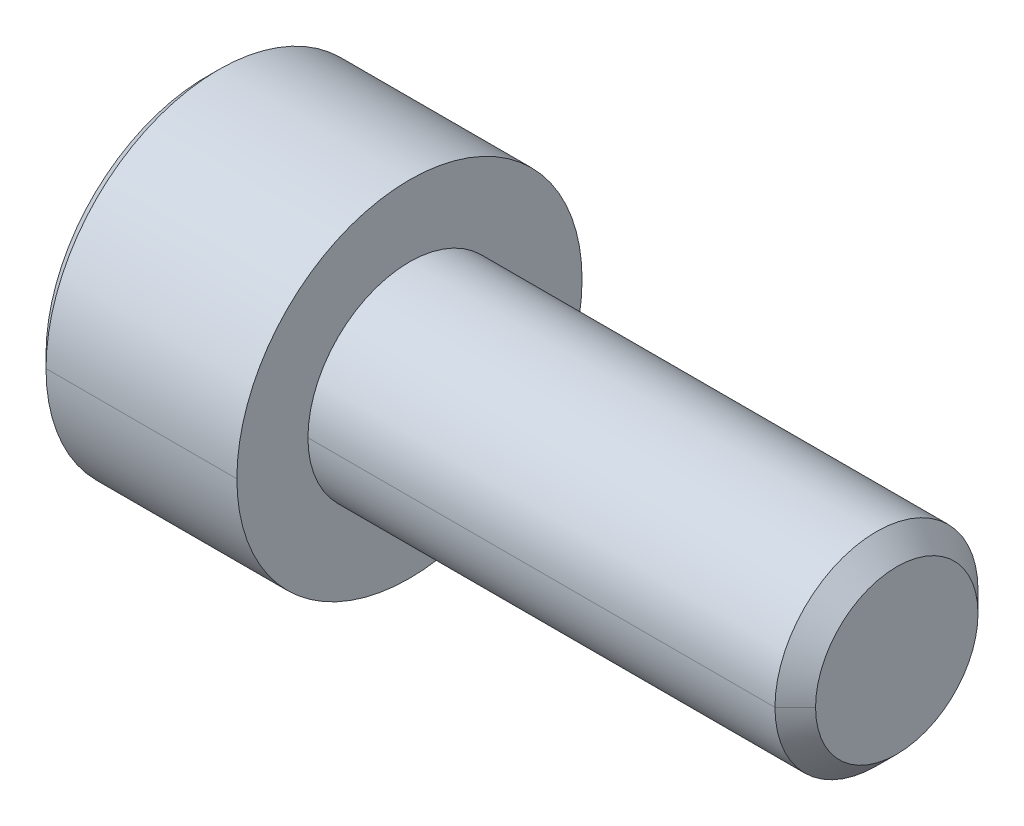
ISO-10303-21;
HEADER;
FILE_DESCRIPTION(('STEP AP214'),'2;1');
FILE_NAME('part.step','',(''),(''),'','','');
FILE_SCHEMA(('AUTOMOTIVE_DESIGN { 1 0 10303 214 1 1 1 1 }'));
ENDSEC;
DATA;
#1=APPLICATION_CONTEXT('core data for automotive mechanical design processes');
#2=APPLICATION_PROTOCOL_DEFINITION('international standard','automotive_design',2000,#1);
#3=PRODUCT_CONTEXT('',#1,'mechanical');
#4=PRODUCT('Part','Part','',(#3));
#5=PRODUCT_RELATED_PRODUCT_CATEGORY('part','',(#4));
#6=PRODUCT_DEFINITION_FORMATION('','',#4);
#7=PRODUCT_DEFINITION_CONTEXT('part definition',#1,'design');
#8=PRODUCT_DEFINITION('design','',#6,#7);
#9=PRODUCT_DEFINITION_SHAPE('','',#8);
#10=(LENGTH_UNIT() NAMED_UNIT(*) SI_UNIT(.MILLI.,.METRE.));
#11=(NAMED_UNIT(*) PLANE_ANGLE_UNIT() SI_UNIT($,.RADIAN.));
#12=(NAMED_UNIT(*) SI_UNIT($,.STERADIAN.) SOLID_ANGLE_UNIT());
#13=UNCERTAINTY_MEASURE_WITH_UNIT(LENGTH_MEASURE(1.E-05),#10,'distance_accuracy_value','');
#14=(GEOMETRIC_REPRESENTATION_CONTEXT(3) GLOBAL_UNCERTAINTY_ASSIGNED_CONTEXT((#13)) GLOBAL_UNIT_ASSIGNED_CONTEXT((#10,
#11,#12)) REPRESENTATION_CONTEXT('',''));
#15=CARTESIAN_POINT('',(0.,0.,0.));
#16=DIRECTION('',(0.,0.,1.));
#17=DIRECTION('',(1.,0.,0.));
#18=AXIS2_PLACEMENT_3D('',#15,#16,#17);
#19=CARTESIAN_POINT('',(-10.8,4.67653718043597,2.7));
#20=DIRECTION('',(0.894427190999916,-0.387298334620742,-0.223606797749979));
#21=DIRECTION('',(0.,0.5,-0.866025403784439));
#22=AXIS2_PLACEMENT_3D('',#19,#20,#21);
#23=PLANE('',#22);
#24=DIRECTION('',(0.397359707119513,0.458831467741124,0.794719414239026));
#25=VECTOR('',#24,1.);
#26=CARTESIAN_POINT('',(-14.5,-1.15470053837925,-2.));
#27=LINE('',#26,#25);
#28=CARTESIAN_POINT('',(-14.5,-1.15470053837925,-2.));
#29=VERTEX_POINT('',#28);
#30=CARTESIAN_POINT('',(-13.5,0.,0.));
#31=VERTEX_POINT('',#30);
#32=EDGE_CURVE('E167',#29,#31,#27,.T.);
#33=ORIENTED_EDGE('',*,*,#32,.F.);
#34=CARTESIAN_POINT('',(-14.5,-1.15470053837925,-2.));
#35=CARTESIAN_POINT('',(-14.5,-1.539600717839,-1.33333333333333));
#36=CARTESIAN_POINT('',(-14.5,-1.92450089729875,-0.666666666666667));
#37=CARTESIAN_POINT('',(-14.5,-2.30940107675851,0.));
#38=(BOUNDED_CURVE() B_SPLINE_CURVE(3,(#34,#35,#36,#37),.UNSPECIFIED.,.F.,
.F.) B_SPLINE_CURVE_WITH_KNOTS((4,4),(0.,1.),
.UNSPECIFIED.) CURVE() GEOMETRIC_REPRESENTATION_ITEM() RATIONAL_B_SPLINE_CURVE((1.,1.,1.,1.)) REPRESENTATION_ITEM(''));
#39=CARTESIAN_POINT('',(-14.5,-2.30940107675851,0.));
#40=VERTEX_POINT('',#39);
#41=EDGE_CURVE('E169',#29,#40,#38,.T.);
#42=ORIENTED_EDGE('',*,*,#41,.T.);
#43=DIRECTION('',(0.397359707119513,0.917662935482247,0.));
#44=VECTOR('',#43,1.);
#45=CARTESIAN_POINT('',(-14.5,-2.30940107675851,0.));
#46=LINE('',#45,#44);
#47=EDGE_CURVE('E10',#40,#31,#46,.T.);
#48=ORIENTED_EDGE('',*,*,#47,.T.);
#49=EDGE_LOOP('',(#33,#42,#48));
#50=FACE_BOUND('',#49,.T.);
#51=ADVANCED_FACE('F16',(#50),#23,.F.);
#52=CARTESIAN_POINT('',(-10.8,4.67653718043597,-2.7));
#53=DIRECTION('',(0.894427190999916,-0.387298334620742,0.223606797749978));
#54=DIRECTION('',(0.,-0.5,-0.866025403784439));
#55=AXIS2_PLACEMENT_3D('',#52,#53,#54);
#56=PLANE('',#55);
#57=ORIENTED_EDGE('',*,*,#47,.F.);
#58=CARTESIAN_POINT('',(-14.5,-2.30940107675851,0.));
#59=CARTESIAN_POINT('',(-14.5,-1.92450089729875,0.666666666666667));
#60=CARTESIAN_POINT('',(-14.5,-1.53960071783901,1.33333333333333));
#61=CARTESIAN_POINT('',(-14.5,-1.15470053837925,2.));
#62=(BOUNDED_CURVE() B_SPLINE_CURVE(3,(#58,#59,#60,#61),.UNSPECIFIED.,.F.,
.F.) B_SPLINE_CURVE_WITH_KNOTS((4,4),(0.,1.),
.UNSPECIFIED.) CURVE() GEOMETRIC_REPRESENTATION_ITEM() RATIONAL_B_SPLINE_CURVE((1.,1.,1.,1.)) REPRESENTATION_ITEM(''));
#63=CARTESIAN_POINT('',(-14.5,-1.15470053837925,2.));
#64=VERTEX_POINT('',#63);
#65=EDGE_CURVE('E20',#40,#64,#62,.T.);
#66=ORIENTED_EDGE('',*,*,#65,.T.);
#67=DIRECTION('',(0.397359707119513,0.458831467741124,-0.794719414239026));
#68=VECTOR('',#67,1.);
#69=CARTESIAN_POINT('',(-14.5,-1.15470053837925,2.));
#70=LINE('',#69,#68);
#71=EDGE_CURVE('E29',#64,#31,#70,.T.);
#72=ORIENTED_EDGE('',*,*,#71,.T.);
#73=EDGE_LOOP('',(#57,#66,#72));
#74=FACE_BOUND('',#73,.T.);
#75=ADVANCED_FACE('F376',(#74),#56,.F.);
#76=CARTESIAN_POINT('',(-10.8,0.,-5.4));
#77=DIRECTION('',(0.894427190999916,0.,0.447213595499958));
#78=DIRECTION('',(0.,-1.,0.));
#79=AXIS2_PLACEMENT_3D('',#76,#77,#78);
#80=PLANE('',#79);
#81=ORIENTED_EDGE('',*,*,#71,.F.);
#82=CARTESIAN_POINT('',(-14.5,-1.15470053837925,2.));
#83=CARTESIAN_POINT('',(-14.5,-0.384900179459752,2.));
#84=CARTESIAN_POINT('',(-14.5,0.38490017945975,2.));
#85=CARTESIAN_POINT('',(-14.5,1.15470053837925,2.));
#86=(BOUNDED_CURVE() B_SPLINE_CURVE(3,(#82,#83,#84,#85),.UNSPECIFIED.,.F.,
.F.) B_SPLINE_CURVE_WITH_KNOTS((4,4),(0.,1.),
.UNSPECIFIED.) CURVE() GEOMETRIC_REPRESENTATION_ITEM() RATIONAL_B_SPLINE_CURVE((1.,1.,1.,1.)) REPRESENTATION_ITEM(''));
#87=CARTESIAN_POINT('',(-14.5,1.15470053837925,2.));
#88=VERTEX_POINT('',#87);
#89=EDGE_CURVE('E240',#64,#88,#86,.T.);
#90=ORIENTED_EDGE('',*,*,#89,.T.);
#91=DIRECTION('',(0.397359707119513,-0.458831467741124,-0.794719414239026));
#92=VECTOR('',#91,1.);
#93=CARTESIAN_POINT('',(-14.5,1.15470053837925,2.));
#94=LINE('',#93,#92);
#95=EDGE_CURVE('E61',#88,#31,#94,.T.);
#96=ORIENTED_EDGE('',*,*,#95,.T.);
#97=EDGE_LOOP('',(#81,#90,#96));
#98=FACE_BOUND('',#97,.T.);
#99=ADVANCED_FACE('F355',(#98),#80,.F.);
#100=CARTESIAN_POINT('',(-10.8,-4.67653718043597,-2.7));
#101=DIRECTION('',(0.894427190999916,0.387298334620742,0.223606797749979));
#102=DIRECTION('',(0.,0.5,-0.866025403784439));
#103=AXIS2_PLACEMENT_3D('',#100,#101,#102);
#104=PLANE('',#103);
#105=ORIENTED_EDGE('',*,*,#95,.F.);
#106=CARTESIAN_POINT('',(-14.5,1.15470053837925,2.));
#107=CARTESIAN_POINT('',(-14.5,1.539600717839,1.33333333333333));
#108=CARTESIAN_POINT('',(-14.5,1.92450089729875,0.666666666666667));
#109=CARTESIAN_POINT('',(-14.5,2.30940107675851,0.));
#110=(BOUNDED_CURVE() B_SPLINE_CURVE(3,(#106,#107,#108,#109),.UNSPECIFIED.,.F.,
.F.) B_SPLINE_CURVE_WITH_KNOTS((4,4),(0.,1.),
.UNSPECIFIED.) CURVE() GEOMETRIC_REPRESENTATION_ITEM() RATIONAL_B_SPLINE_CURVE((1.,1.,1.,1.)) REPRESENTATION_ITEM(''));
#111=CARTESIAN_POINT('',(-14.5,2.30940107675851,0.));
#112=VERTEX_POINT('',#111);
#113=EDGE_CURVE('E253',#88,#112,#110,.T.);
#114=ORIENTED_EDGE('',*,*,#113,.T.);
#115=DIRECTION('',(0.397359707119513,-0.917662935482247,0.));
#116=VECTOR('',#115,1.);
#117=CARTESIAN_POINT('',(-14.5,2.30940107675851,0.));
#118=LINE('',#117,#116);
#119=EDGE_CURVE('E75',#112,#31,#118,.T.);
#120=ORIENTED_EDGE('',*,*,#119,.T.);
#121=EDGE_LOOP('',(#105,#114,#120));
#122=FACE_BOUND('',#121,.T.);
#123=ADVANCED_FACE('F366',(#122),#104,.F.);
#124=CARTESIAN_POINT('',(-10.8,0.,5.4));
#125=DIRECTION('',(0.894427190999916,0.,-0.447213595499958));
#126=DIRECTION('',(0.,-1.,0.));
#127=AXIS2_PLACEMENT_3D('',#124,#125,#126);
#128=PLANE('',#127);
#129=DIRECTION('',(0.397359707119513,-0.458831467741124,0.794719414239026));
#130=VECTOR('',#129,1.);
#131=CARTESIAN_POINT('',(-14.5,1.15470053837925,-2.));
#132=LINE('',#131,#130);
#133=CARTESIAN_POINT('',(-14.5,1.15470053837925,-2.));
#134=VERTEX_POINT('',#133);
#135=EDGE_CURVE('E173',#134,#31,#132,.T.);
#136=ORIENTED_EDGE('',*,*,#135,.F.);
#137=CARTESIAN_POINT('',(-14.5,1.15470053837925,-2.));
#138=CARTESIAN_POINT('',(-14.5,0.384900179459751,-2.));
#139=CARTESIAN_POINT('',(-14.5,-0.384900179459751,-2.));
#140=CARTESIAN_POINT('',(-14.5,-1.15470053837925,-2.));
#141=(BOUNDED_CURVE() B_SPLINE_CURVE(3,(#137,#138,#139,#140),.UNSPECIFIED.,.F.,
.F.) B_SPLINE_CURVE_WITH_KNOTS((4,4),(0.,1.),
.UNSPECIFIED.) CURVE() GEOMETRIC_REPRESENTATION_ITEM() RATIONAL_B_SPLINE_CURVE((1.,1.,1.,1.)) REPRESENTATION_ITEM(''));
#142=EDGE_CURVE('E176',#134,#29,#141,.T.);
#143=ORIENTED_EDGE('',*,*,#142,.T.);
#144=ORIENTED_EDGE('',*,*,#32,.T.);
#145=EDGE_LOOP('',(#136,#143,#144));
#146=FACE_BOUND('',#145,.T.);
#147=ADVANCED_FACE('F177',(#146),#128,.F.);
#148=CARTESIAN_POINT('',(-10.8,-4.67653718043597,2.7));
#149=DIRECTION('',(0.894427190999916,0.387298334620742,-0.223606797749979));
#150=DIRECTION('',(0.,-0.5,-0.866025403784439));
#151=AXIS2_PLACEMENT_3D('',#148,#149,#150);
#152=PLANE('',#151);
#153=ORIENTED_EDGE('',*,*,#119,.F.);
#154=CARTESIAN_POINT('',(-14.5,2.30940107675851,0.));
#155=CARTESIAN_POINT('',(-14.5,1.92450089729875,-0.666666666666667));
#156=CARTESIAN_POINT('',(-14.5,1.539600717839,-1.33333333333333));
#157=CARTESIAN_POINT('',(-14.5,1.15470053837925,-2.));
#158=(BOUNDED_CURVE() B_SPLINE_CURVE(3,(#154,#155,#156,#157),.UNSPECIFIED.,.F.,
.F.) B_SPLINE_CURVE_WITH_KNOTS((4,4),(0.,1.),
.UNSPECIFIED.) CURVE() GEOMETRIC_REPRESENTATION_ITEM() RATIONAL_B_SPLINE_CURVE((1.,1.,1.,1.)) REPRESENTATION_ITEM(''));
#159=EDGE_CURVE('E281',#112,#134,#158,.T.);
#160=ORIENTED_EDGE('',*,*,#159,.T.);
#161=ORIENTED_EDGE('',*,*,#135,.T.);
#162=EDGE_LOOP('',(#153,#160,#161));
#163=FACE_BOUND('',#162,.T.);
#164=ADVANCED_FACE('F374',(#163),#152,.F.);
#165=CARTESIAN_POINT('',(-17.,0.,0.));
#166=DIRECTION('',(1.,0.,0.));
#167=DIRECTION('',(0.,0.,-1.));
#168=AXIS2_PLACEMENT_3D('',#165,#166,#167);
#169=CONICAL_SURFACE('',#168,3.95,0.785398163397446);
#170=DIRECTION('',(0.70710678118655,0.,0.707106781186546));
#171=VECTOR('',#170,1.);
#172=CARTESIAN_POINT('',(-17.,0.,3.95));
#173=LINE('',#172,#171);
#174=CARTESIAN_POINT('',(-17.,0.,3.95));
#175=VERTEX_POINT('',#174);
#176=CARTESIAN_POINT('',(-16.7,0.,4.25));
#177=VERTEX_POINT('',#176);
#178=EDGE_CURVE('E235',#175,#177,#173,.T.);
#179=ORIENTED_EDGE('',*,*,#178,.F.);
#180=CARTESIAN_POINT('',(-17.,0.,0.));
#181=DIRECTION('',(-1.,0.,0.));
#182=DIRECTION('',(0.,0.,-1.));
#183=AXIS2_PLACEMENT_3D('',#180,#181,#182);
#184=CIRCLE('',#183,3.95);
#185=CARTESIAN_POINT('',(-17.,0.,-3.95));
#186=VERTEX_POINT('',#185);
#187=EDGE_CURVE('E104',#186,#175,#184,.T.);
#188=ORIENTED_EDGE('',*,*,#187,.F.);
#189=DIRECTION('',(0.70710678118655,0.,-0.707106781186546));
#190=VECTOR('',#189,1.);
#191=CARTESIAN_POINT('',(-17.,0.,-3.95));
#192=LINE('',#191,#190);
#193=CARTESIAN_POINT('',(-16.7,0.,-4.25));
#194=VERTEX_POINT('',#193);
#195=EDGE_CURVE('E254',#186,#194,#192,.T.);
#196=ORIENTED_EDGE('',*,*,#195,.T.);
#197=CARTESIAN_POINT('',(-16.7,0.,0.));
#198=DIRECTION('',(1.,0.,0.));
#199=DIRECTION('',(0.,0.,-1.));
#200=AXIS2_PLACEMENT_3D('',#197,#198,#199);
#201=CIRCLE('',#200,4.25);
#202=EDGE_CURVE('E258',#177,#194,#201,.T.);
#203=ORIENTED_EDGE('',*,*,#202,.F.);
#204=EDGE_LOOP('',(#179,#188,#196,#203));
#205=FACE_BOUND('',#204,.T.);
#206=ADVANCED_FACE('F404',(#205),#169,.T.);
#207=CARTESIAN_POINT('',(-14.5,2.30940107675851,0.));
#208=DIRECTION('',(0.,0.866025403784439,-0.5));
#209=DIRECTION('',(-1.,0.,0.));
#210=AXIS2_PLACEMENT_3D('',#207,#208,#209);
#211=PLANE('',#210);
#212=DIRECTION('',(0.,-0.5,-0.866025403784439));
#213=VECTOR('',#212,1.);
#214=CARTESIAN_POINT('',(-17.,2.30940107675851,0.));
#215=LINE('',#214,#213);
#216=CARTESIAN_POINT('',(-17.,2.30940107675851,0.));
#217=VERTEX_POINT('',#216);
#218=CARTESIAN_POINT('',(-17.,1.15470053837925,-2.));
#219=VERTEX_POINT('',#218);
#220=EDGE_CURVE('E207',#217,#219,#215,.T.);
#221=ORIENTED_EDGE('',*,*,#220,.T.);
#222=DIRECTION('',(-1.,0.,0.));
#223=VECTOR('',#222,1.);
#224=CARTESIAN_POINT('',(-14.5,1.15470053837925,-2.));
#225=LINE('',#224,#223);
#226=EDGE_CURVE('E180',#134,#219,#225,.T.);
#227=ORIENTED_EDGE('',*,*,#226,.F.);
#228=ORIENTED_EDGE('',*,*,#159,.F.);
#229=DIRECTION('',(-1.,0.,0.));
#230=VECTOR('',#229,1.);
#231=CARTESIAN_POINT('',(-14.5,2.30940107675851,0.));
#232=LINE('',#231,#230);
#233=EDGE_CURVE('E333',#112,#217,#232,.T.);
#234=ORIENTED_EDGE('',*,*,#233,.T.);
#235=EDGE_LOOP('',(#221,#227,#228,#234));
#236=FACE_BOUND('',#235,.T.);
#237=ADVANCED_FACE('F407',(#236),#211,.F.);
#238=CARTESIAN_POINT('',(-14.5,1.15470053837925,-2.));
#239=DIRECTION('',(0.,0.,-1.));
#240=DIRECTION('',(0.,-1.,0.));
#241=AXIS2_PLACEMENT_3D('',#238,#239,#240);
#242=PLANE('',#241);
#243=DIRECTION('',(0.,-1.,0.));
#244=VECTOR('',#243,1.);
#245=CARTESIAN_POINT('',(-17.,1.15470053837925,-2.));
#246=LINE('',#245,#244);
#247=CARTESIAN_POINT('',(-17.,-1.15470053837925,-2.));
#248=VERTEX_POINT('',#247);
#249=EDGE_CURVE('E184',#219,#248,#246,.T.);
#250=ORIENTED_EDGE('',*,*,#249,.T.);
#251=DIRECTION('',(-1.,0.,0.));
#252=VECTOR('',#251,1.);
#253=CARTESIAN_POINT('',(-14.5,-1.15470053837925,-2.));
#254=LINE('',#253,#252);
#255=EDGE_CURVE('E89',#29,#248,#254,.T.);
#256=ORIENTED_EDGE('',*,*,#255,.F.);
#257=ORIENTED_EDGE('',*,*,#142,.F.);
#258=ORIENTED_EDGE('',*,*,#226,.T.);
#259=EDGE_LOOP('',(#250,#256,#257,#258));
#260=FACE_BOUND('',#259,.T.);
#261=ADVANCED_FACE('F182',(#260),#242,.F.);
#262=CARTESIAN_POINT('',(-14.5,-1.15470053837925,-2.));
#263=DIRECTION('',(0.,-0.866025403784439,-0.5));
#264=DIRECTION('',(0.,0.5,-0.866025403784439));
#265=AXIS2_PLACEMENT_3D('',#262,#263,#264);
#266=PLANE('',#265);
#267=DIRECTION('',(0.,-0.5,0.866025403784439));
#268=VECTOR('',#267,1.);
#269=CARTESIAN_POINT('',(-17.,-1.15470053837925,-2.));
#270=LINE('',#269,#268);
#271=CARTESIAN_POINT('',(-17.,-2.30940107675851,0.));
#272=VERTEX_POINT('',#271);
#273=EDGE_CURVE('E228',#248,#272,#270,.T.);
#274=ORIENTED_EDGE('',*,*,#273,.T.);
#275=DIRECTION('',(-1.,0.,0.));
#276=VECTOR('',#275,1.);
#277=CARTESIAN_POINT('',(-14.5,-2.30940107675851,0.));
#278=LINE('',#277,#276);
#279=EDGE_CURVE('E189',#40,#272,#278,.T.);
#280=ORIENTED_EDGE('',*,*,#279,.F.);
#281=ORIENTED_EDGE('',*,*,#41,.F.);
#282=ORIENTED_EDGE('',*,*,#255,.T.);
#283=EDGE_LOOP('',(#274,#280,#281,#282));
#284=FACE_BOUND('',#283,.T.);
#285=ADVANCED_FACE('F188',(#284),#266,.F.);
#286=CARTESIAN_POINT('',(-14.5,-2.30940107675851,0.));
#287=DIRECTION('',(0.,-0.866025403784439,0.5));
#288=DIRECTION('',(-1.,0.,0.));
#289=AXIS2_PLACEMENT_3D('',#286,#287,#288);
#290=PLANE('',#289);
#291=DIRECTION('',(0.,0.5,0.866025403784439));
#292=VECTOR('',#291,1.);
#293=CARTESIAN_POINT('',(-17.,-2.30940107675851,0.));
#294=LINE('',#293,#292);
#295=CARTESIAN_POINT('',(-17.,-1.15470053837925,2.));
#296=VERTEX_POINT('',#295);
#297=EDGE_CURVE('E231',#272,#296,#294,.T.);
#298=ORIENTED_EDGE('',*,*,#297,.T.);
#299=DIRECTION('',(-1.,0.,0.));
#300=VECTOR('',#299,1.);
#301=CARTESIAN_POINT('',(-14.5,-1.15470053837925,2.));
#302=LINE('',#301,#300);
#303=EDGE_CURVE('E236',#64,#296,#302,.T.);
#304=ORIENTED_EDGE('',*,*,#303,.F.);
#305=ORIENTED_EDGE('',*,*,#65,.F.);
#306=ORIENTED_EDGE('',*,*,#279,.T.);
#307=EDGE_LOOP('',(#298,#304,#305,#306));
#308=FACE_BOUND('',#307,.T.);
#309=ADVANCED_FACE('F393',(#308),#290,.F.);
#310=CARTESIAN_POINT('',(-14.5,-1.15470053837925,2.));
#311=DIRECTION('',(0.,0.,1.));
#312=DIRECTION('',(0.,-1.,0.));
#313=AXIS2_PLACEMENT_3D('',#310,#311,#312);
#314=PLANE('',#313);
#315=DIRECTION('',(0.,1.,0.));
#316=VECTOR('',#315,1.);
#317=CARTESIAN_POINT('',(-17.,-1.15470053837925,2.));
#318=LINE('',#317,#316);
#319=CARTESIAN_POINT('',(-17.,1.15470053837925,2.));
#320=VERTEX_POINT('',#319);
#321=EDGE_CURVE('E316',#296,#320,#318,.T.);
#322=ORIENTED_EDGE('',*,*,#321,.T.);
#323=DIRECTION('',(-1.,0.,0.));
#324=VECTOR('',#323,1.);
#325=CARTESIAN_POINT('',(-14.5,1.15470053837925,2.));
#326=LINE('',#325,#324);
#327=EDGE_CURVE('E250',#88,#320,#326,.T.);
#328=ORIENTED_EDGE('',*,*,#327,.F.);
#329=ORIENTED_EDGE('',*,*,#89,.F.);
#330=ORIENTED_EDGE('',*,*,#303,.T.);
#331=EDGE_LOOP('',(#322,#328,#329,#330));
#332=FACE_BOUND('',#331,.T.);
#333=ADVANCED_FACE('F360',(#332),#314,.F.);
#334=CARTESIAN_POINT('',(-14.5,1.15470053837925,2.));
#335=DIRECTION('',(0.,0.866025403784439,0.5));
#336=DIRECTION('',(1.,0.,0.));
#337=AXIS2_PLACEMENT_3D('',#334,#335,#336);
#338=PLANE('',#337);
#339=DIRECTION('',(0.,0.5,-0.866025403784439));
#340=VECTOR('',#339,1.);
#341=CARTESIAN_POINT('',(-17.,1.15470053837925,2.));
#342=LINE('',#341,#340);
#343=EDGE_CURVE('E211',#320,#217,#342,.T.);
#344=ORIENTED_EDGE('',*,*,#343,.T.);
#345=ORIENTED_EDGE('',*,*,#233,.F.);
#346=ORIENTED_EDGE('',*,*,#113,.F.);
#347=ORIENTED_EDGE('',*,*,#327,.T.);
#348=EDGE_LOOP('',(#344,#345,#346,#347));
#349=FACE_BOUND('',#348,.T.);
#350=ADVANCED_FACE('F365',(#349),#338,.F.);
#351=CARTESIAN_POINT('',(-0.5,0.,0.));
#352=DIRECTION('',(-1.,0.,0.));
#353=DIRECTION('',(0.,0.,1.));
#354=AXIS2_PLACEMENT_3D('',#351,#352,#353);
#355=CONICAL_SURFACE('',#354,2.5,0.78539816339745);
#356=DIRECTION('',(-0.707106781186546,0.,-0.707106781186549));
#357=VECTOR('',#356,1.);
#358=CARTESIAN_POINT('',(-0.5,0.,-2.5));
#359=LINE('',#358,#357);
#360=CARTESIAN_POINT('',(0.,0.,-2.));
#361=VERTEX_POINT('',#360);
#362=CARTESIAN_POINT('',(-0.5,0.,-2.5));
#363=VERTEX_POINT('',#362);
#364=EDGE_CURVE('E312',#361,#363,#359,.T.);
#365=ORIENTED_EDGE('',*,*,#364,.F.);
#366=CARTESIAN_POINT('',(0.,0.,0.));
#367=DIRECTION('',(1.,0.,0.));
#368=DIRECTION('',(0.,0.,1.));
#369=AXIS2_PLACEMENT_3D('',#366,#367,#368);
#370=CIRCLE('',#369,2.);
#371=CARTESIAN_POINT('',(0.,0.,2.));
#372=VERTEX_POINT('',#371);
#373=EDGE_CURVE('E159',#372,#361,#370,.T.);
#374=ORIENTED_EDGE('',*,*,#373,.F.);
#375=DIRECTION('',(-0.707106781186546,0.,0.707106781186549));
#376=VECTOR('',#375,1.);
#377=CARTESIAN_POINT('',(-0.5,0.,2.5));
#378=LINE('',#377,#376);
#379=CARTESIAN_POINT('',(-0.5,0.,2.5));
#380=VERTEX_POINT('',#379);
#381=EDGE_CURVE('E227',#372,#380,#378,.T.);
#382=ORIENTED_EDGE('',*,*,#381,.T.);
#383=CARTESIAN_POINT('',(-0.5,0.,0.));
#384=DIRECTION('',(-1.,0.,0.));
#385=DIRECTION('',(0.,0.,1.));
#386=AXIS2_PLACEMENT_3D('',#383,#384,#385);
#387=CIRCLE('',#386,2.5);
#388=EDGE_CURVE('E147',#363,#380,#387,.T.);
#389=ORIENTED_EDGE('',*,*,#388,.F.);
#390=EDGE_LOOP('',(#365,#374,#382,#389));
#391=FACE_BOUND('',#390,.T.);
#392=ADVANCED_FACE('F408',(#391),#355,.T.);
#393=CARTESIAN_POINT('',(-17.,4.25,0.));
#394=DIRECTION('',(1.,0.,0.));
#395=DIRECTION('',(0.,1.,0.));
#396=AXIS2_PLACEMENT_3D('',#393,#394,#395);
#397=PLANE('',#396);
#398=ORIENTED_EDGE('',*,*,#220,.F.);
#399=ORIENTED_EDGE('',*,*,#343,.F.);
#400=ORIENTED_EDGE('',*,*,#321,.F.);
#401=ORIENTED_EDGE('',*,*,#297,.F.);
#402=ORIENTED_EDGE('',*,*,#273,.F.);
#403=ORIENTED_EDGE('',*,*,#249,.F.);
#404=EDGE_LOOP('',(#398,#399,#400,#401,#402,#403));
#405=FACE_BOUND('',#404,.T.);
#406=ORIENTED_EDGE('',*,*,#187,.T.);
#407=CARTESIAN_POINT('',(-17.,0.,0.));
#408=DIRECTION('',(-1.,0.,0.));
#409=DIRECTION('',(0.,0.,-1.));
#410=AXIS2_PLACEMENT_3D('',#407,#408,#409);
#411=CIRCLE('',#410,3.95);
#412=EDGE_CURVE('E232',#175,#186,#411,.T.);
#413=ORIENTED_EDGE('',*,*,#412,.T.);
#414=EDGE_LOOP('',(#406,#413));
#415=FACE_BOUND('',#414,.T.);
#416=ADVANCED_FACE('F411',(#405,#415),#397,.F.);
#417=CARTESIAN_POINT('',(0.,0.,0.));
#418=DIRECTION('',(-1.,0.,0.));
#419=DIRECTION('',(0.,0.,1.));
#420=AXIS2_PLACEMENT_3D('',#417,#418,#419);
#421=CYLINDRICAL_SURFACE('',#420,4.25);
#422=DIRECTION('',(-1.,0.,0.));
#423=VECTOR('',#422,1.);
#424=CARTESIAN_POINT('',(0.,0.,-4.25));
#425=LINE('',#424,#423);
#426=CARTESIAN_POINT('',(-12.,0.,-4.25));
#427=VERTEX_POINT('',#426);
#428=EDGE_CURVE('E222',#427,#194,#425,.T.);
#429=ORIENTED_EDGE('',*,*,#428,.F.);
#430=CARTESIAN_POINT('',(-12.,0.,0.));
#431=DIRECTION('',(-1.,0.,0.));
#432=DIRECTION('',(0.,0.,1.));
#433=AXIS2_PLACEMENT_3D('',#430,#431,#432);
#434=CIRCLE('',#433,4.25);
#435=CARTESIAN_POINT('',(-12.,0.,4.25));
#436=VERTEX_POINT('',#435);
#437=EDGE_CURVE('E264',#427,#436,#434,.T.);
#438=ORIENTED_EDGE('',*,*,#437,.T.);
#439=DIRECTION('',(-1.,0.,0.));
#440=VECTOR('',#439,1.);
#441=CARTESIAN_POINT('',(0.,0.,4.25));
#442=LINE('',#441,#440);
#443=EDGE_CURVE('E218',#436,#177,#442,.T.);
#444=ORIENTED_EDGE('',*,*,#443,.T.);
#445=ORIENTED_EDGE('',*,*,#202,.T.);
#446=EDGE_LOOP('',(#429,#438,#444,#445));
#447=FACE_BOUND('',#446,.T.);
#448=ADVANCED_FACE('F18',(#447),#421,.T.);
#449=CARTESIAN_POINT('',(-12.,2.5,0.));
#450=DIRECTION('',(-1.,0.,0.));
#451=DIRECTION('',(0.,0.,1.));
#452=AXIS2_PLACEMENT_3D('',#449,#450,#451);
#453=PLANE('',#452);
#454=CARTESIAN_POINT('',(-12.,0.,0.));
#455=DIRECTION('',(-1.,0.,0.));
#456=DIRECTION('',(0.,0.,1.));
#457=AXIS2_PLACEMENT_3D('',#454,#455,#456);
#458=CIRCLE('',#457,2.5);
#459=CARTESIAN_POINT('',(-12.,0.,2.5));
#460=VERTEX_POINT('',#459);
#461=CARTESIAN_POINT('',(-12.,0.,-2.5));
#462=VERTEX_POINT('',#461);
#463=EDGE_CURVE('E212',#460,#462,#458,.T.);
#464=ORIENTED_EDGE('',*,*,#463,.T.);
#465=CARTESIAN_POINT('',(-12.,0.,0.));
#466=DIRECTION('',(-1.,0.,0.));
#467=DIRECTION('',(0.,0.,1.));
#468=AXIS2_PLACEMENT_3D('',#465,#466,#467);
#469=CIRCLE('',#468,2.5);
#470=EDGE_CURVE('E274',#462,#460,#469,.T.);
#471=ORIENTED_EDGE('',*,*,#470,.T.);
#472=EDGE_LOOP('',(#464,#471));
#473=FACE_BOUND('',#472,.T.);
#474=CARTESIAN_POINT('',(-12.,0.,0.));
#475=DIRECTION('',(-1.,0.,0.));
#476=DIRECTION('',(0.,0.,1.));
#477=AXIS2_PLACEMENT_3D('',#474,#475,#476);
#478=CIRCLE('',#477,4.25);
#479=EDGE_CURVE('E223',#436,#427,#478,.T.);
#480=ORIENTED_EDGE('',*,*,#479,.F.);
#481=ORIENTED_EDGE('',*,*,#437,.F.);
#482=EDGE_LOOP('',(#480,#481));
#483=FACE_BOUND('',#482,.T.);
#484=ADVANCED_FACE('F390',(#473,#483),#453,.F.);
#485=CARTESIAN_POINT('',(0.,0.,0.));
#486=DIRECTION('',(-1.,0.,0.));
#487=DIRECTION('',(0.,0.,1.));
#488=AXIS2_PLACEMENT_3D('',#485,#486,#487);
#489=CYLINDRICAL_SURFACE('',#488,2.5);
#490=DIRECTION('',(-1.,0.,0.));
#491=VECTOR('',#490,1.);
#492=CARTESIAN_POINT('',(0.,0.,-2.5));
#493=LINE('',#492,#491);
#494=EDGE_CURVE('E217',#363,#462,#493,.T.);
#495=ORIENTED_EDGE('',*,*,#494,.F.);
#496=ORIENTED_EDGE('',*,*,#388,.T.);
#497=DIRECTION('',(-1.,0.,0.));
#498=VECTOR('',#497,1.);
#499=CARTESIAN_POINT('',(0.,0.,2.5));
#500=LINE('',#499,#498);
#501=EDGE_CURVE('E216',#380,#460,#500,.T.);
#502=ORIENTED_EDGE('',*,*,#501,.T.);
#503=ORIENTED_EDGE('',*,*,#470,.F.);
#504=EDGE_LOOP('',(#495,#496,#502,#503));
#505=FACE_BOUND('',#504,.T.);
#506=ADVANCED_FACE('F387',(#505),#489,.T.);
#507=CARTESIAN_POINT('',(0.,0.,0.));
#508=DIRECTION('',(-1.,0.,0.));
#509=DIRECTION('',(0.,0.,1.));
#510=AXIS2_PLACEMENT_3D('',#507,#508,#509);
#511=PLANE('',#510);
#512=ORIENTED_EDGE('',*,*,#373,.T.);
#513=CARTESIAN_POINT('',(0.,0.,0.));
#514=DIRECTION('',(1.,0.,0.));
#515=DIRECTION('',(0.,0.,1.));
#516=AXIS2_PLACEMENT_3D('',#513,#514,#515);
#517=CIRCLE('',#516,2.);
#518=EDGE_CURVE('E256',#361,#372,#517,.T.);
#519=ORIENTED_EDGE('',*,*,#518,.T.);
#520=EDGE_LOOP('',(#512,#519));
#521=FACE_BOUND('',#520,.T.);
#522=ADVANCED_FACE('F389',(#521),#511,.F.);
#523=CARTESIAN_POINT('',(0.,0.,0.));
#524=DIRECTION('',(-1.,0.,0.));
#525=DIRECTION('',(0.,0.,1.));
#526=AXIS2_PLACEMENT_3D('',#523,#524,#525);
#527=CYLINDRICAL_SURFACE('',#526,2.5);
#528=CARTESIAN_POINT('',(-0.5,0.,0.));
#529=DIRECTION('',(-1.,0.,0.));
#530=DIRECTION('',(0.,0.,1.));
#531=AXIS2_PLACEMENT_3D('',#528,#529,#530);
#532=CIRCLE('',#531,2.5);
#533=EDGE_CURVE('E306',#380,#363,#532,.T.);
#534=ORIENTED_EDGE('',*,*,#533,.T.);
#535=ORIENTED_EDGE('',*,*,#494,.T.);
#536=ORIENTED_EDGE('',*,*,#463,.F.);
#537=ORIENTED_EDGE('',*,*,#501,.F.);
#538=EDGE_LOOP('',(#534,#535,#536,#537));
#539=FACE_BOUND('',#538,.T.);
#540=ADVANCED_FACE('F397',(#539),#527,.T.);
#541=CARTESIAN_POINT('',(0.,0.,0.));
#542=DIRECTION('',(-1.,0.,0.));
#543=DIRECTION('',(0.,0.,1.));
#544=AXIS2_PLACEMENT_3D('',#541,#542,#543);
#545=CYLINDRICAL_SURFACE('',#544,4.25);
#546=ORIENTED_EDGE('',*,*,#479,.T.);
#547=ORIENTED_EDGE('',*,*,#428,.T.);
#548=CARTESIAN_POINT('',(-16.7,0.,0.));
#549=DIRECTION('',(1.,0.,0.));
#550=DIRECTION('',(0.,0.,-1.));
#551=AXIS2_PLACEMENT_3D('',#548,#549,#550);
#552=CIRCLE('',#551,4.25);
#553=EDGE_CURVE('E246',#194,#177,#552,.T.);
#554=ORIENTED_EDGE('',*,*,#553,.T.);
#555=ORIENTED_EDGE('',*,*,#443,.F.);
#556=EDGE_LOOP('',(#546,#547,#554,#555));
#557=FACE_BOUND('',#556,.T.);
#558=ADVANCED_FACE('F400',(#557),#545,.T.);
#559=CARTESIAN_POINT('',(-0.5,0.,0.));
#560=DIRECTION('',(-1.,0.,0.));
#561=DIRECTION('',(0.,0.,1.));
#562=AXIS2_PLACEMENT_3D('',#559,#560,#561);
#563=CONICAL_SURFACE('',#562,2.5,0.78539816339745);
#564=ORIENTED_EDGE('',*,*,#518,.F.);
#565=ORIENTED_EDGE('',*,*,#364,.T.);
#566=ORIENTED_EDGE('',*,*,#533,.F.);
#567=ORIENTED_EDGE('',*,*,#381,.F.);
#568=EDGE_LOOP('',(#564,#565,#566,#567));
#569=FACE_BOUND('',#568,.T.);
#570=ADVANCED_FACE('F415',(#569),#563,.T.);
#571=CARTESIAN_POINT('',(-17.,0.,0.));
#572=DIRECTION('',(1.,0.,0.));
#573=DIRECTION('',(0.,0.,-1.));
#574=AXIS2_PLACEMENT_3D('',#571,#572,#573);
#575=CONICAL_SURFACE('',#574,3.95,0.785398163397446);
#576=ORIENTED_EDGE('',*,*,#412,.F.);
#577=ORIENTED_EDGE('',*,*,#178,.T.);
#578=ORIENTED_EDGE('',*,*,#553,.F.);
#579=ORIENTED_EDGE('',*,*,#195,.F.);
#580=EDGE_LOOP('',(#576,#577,#578,#579));
#581=FACE_BOUND('',#580,.T.);
#582=ADVANCED_FACE('F412',(#581),#575,.T.);
#583=CLOSED_SHELL('',(#51,#75,#99,#123,#147,#164,#206,#237,#261,#285,#309,#333,#350,#392,#416,
#448,#484,#506,#522,#540,#558,#570,#582));
#584=MANIFOLD_SOLID_BREP('B1',#583);
#585=ADVANCED_BREP_SHAPE_REPRESENTATION('',(#18,#584),#14);
#586=SHAPE_DEFINITION_REPRESENTATION(#9,#585);
ENDSEC;
END-ISO-10303-21;
